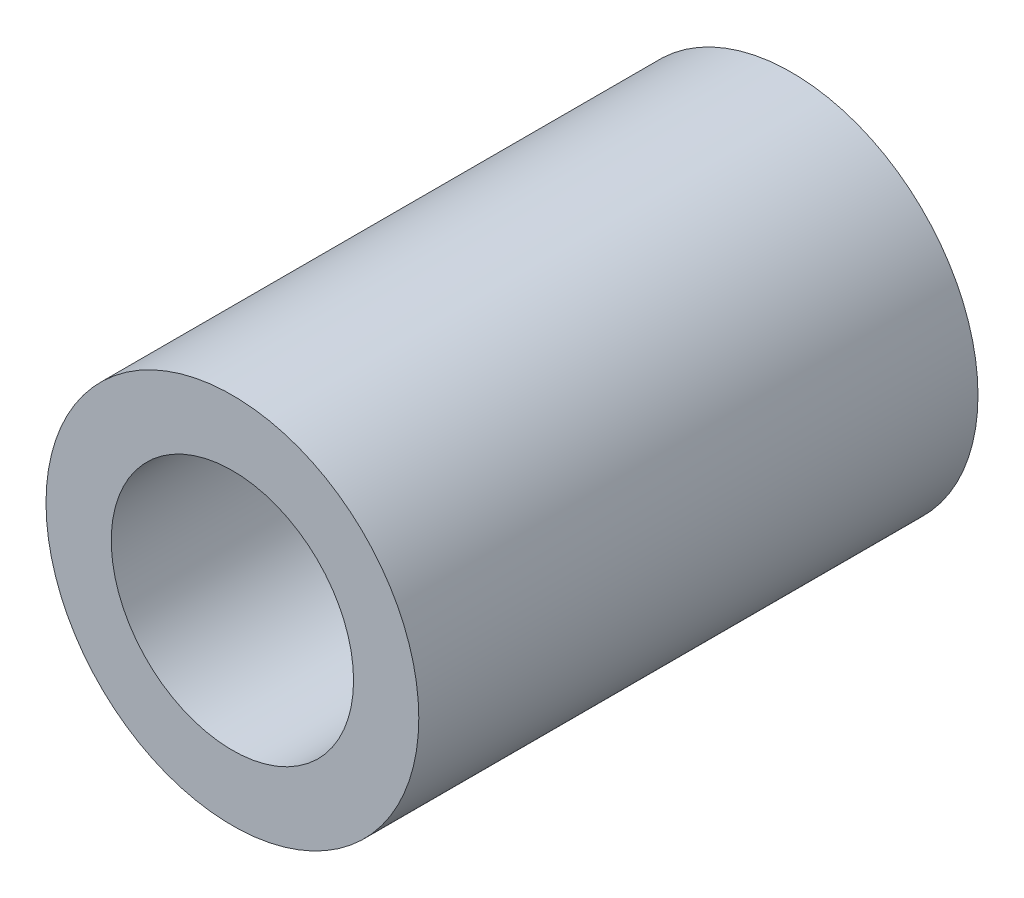
ISO-10303-21;
HEADER;
FILE_DESCRIPTION(('STEP AP214'),'2;1');
FILE_NAME('part.step','',(''),(''),'','','');
FILE_SCHEMA(('AUTOMOTIVE_DESIGN { 1 0 10303 214 1 1 1 1 }'));
ENDSEC;
DATA;
#1=APPLICATION_CONTEXT('core data for automotive mechanical design processes');
#2=APPLICATION_PROTOCOL_DEFINITION('international standard','automotive_design',2000,#1);
#3=PRODUCT_CONTEXT('',#1,'mechanical');
#4=PRODUCT('Part','Part','',(#3));
#5=PRODUCT_RELATED_PRODUCT_CATEGORY('part','',(#4));
#6=PRODUCT_DEFINITION_FORMATION('','',#4);
#7=PRODUCT_DEFINITION_CONTEXT('part definition',#1,'design');
#8=PRODUCT_DEFINITION('design','',#6,#7);
#9=PRODUCT_DEFINITION_SHAPE('','',#8);
#10=(LENGTH_UNIT() NAMED_UNIT(*) SI_UNIT(.MILLI.,.METRE.));
#11=(NAMED_UNIT(*) PLANE_ANGLE_UNIT() SI_UNIT($,.RADIAN.));
#12=(NAMED_UNIT(*) SI_UNIT($,.STERADIAN.) SOLID_ANGLE_UNIT());
#13=UNCERTAINTY_MEASURE_WITH_UNIT(LENGTH_MEASURE(1.E-05),#10,'distance_accuracy_value','');
#14=(GEOMETRIC_REPRESENTATION_CONTEXT(3) GLOBAL_UNCERTAINTY_ASSIGNED_CONTEXT((#13)) GLOBAL_UNIT_ASSIGNED_CONTEXT((#10,
#11,#12)) REPRESENTATION_CONTEXT('',''));
#15=CARTESIAN_POINT('',(0.,0.,0.));
#16=DIRECTION('',(0.,0.,1.));
#17=DIRECTION('',(1.,0.,0.));
#18=AXIS2_PLACEMENT_3D('',#15,#16,#17);
#19=CARTESIAN_POINT('',(0.,0.,12.));
#20=DIRECTION('',(0.,0.,1.));
#21=DIRECTION('',(1.,0.,0.));
#22=AXIS2_PLACEMENT_3D('',#19,#20,#21);
#23=PLANE('',#22);
#24=CARTESIAN_POINT('',(0.,0.,12.));
#25=DIRECTION('',(0.,0.,1.));
#26=DIRECTION('',(1.,0.,0.));
#27=AXIS2_PLACEMENT_3D('',#24,#25,#26);
#28=CIRCLE('',#27,4.);
#29=CARTESIAN_POINT('',(4.,0.,12.));
#30=VERTEX_POINT('',#29);
#31=EDGE_CURVE('E10',#30,#30,#28,.T.);
#32=ORIENTED_EDGE('',*,*,#31,.T.);
#33=EDGE_LOOP('',(#32));
#34=FACE_BOUND('',#33,.T.);
#35=CARTESIAN_POINT('',(0.,0.,12.));
#36=DIRECTION('',(0.,0.,1.));
#37=DIRECTION('',(1.,0.,0.));
#38=AXIS2_PLACEMENT_3D('',#35,#36,#37);
#39=CIRCLE('',#38,2.6);
#40=CARTESIAN_POINT('',(2.6,0.,12.));
#41=VERTEX_POINT('',#40);
#42=EDGE_CURVE('E56',#41,#41,#39,.T.);
#43=ORIENTED_EDGE('',*,*,#42,.F.);
#44=EDGE_LOOP('',(#43));
#45=FACE_BOUND('',#44,.T.);
#46=ADVANCED_FACE('F43',(#34,#45),#23,.T.);
#47=CARTESIAN_POINT('',(0.,0.,0.));
#48=DIRECTION('',(0.,0.,1.));
#49=DIRECTION('',(1.,0.,0.));
#50=AXIS2_PLACEMENT_3D('',#47,#48,#49);
#51=PLANE('',#50);
#52=CARTESIAN_POINT('',(0.,0.,0.));
#53=DIRECTION('',(0.,0.,1.));
#54=DIRECTION('',(1.,0.,0.));
#55=AXIS2_PLACEMENT_3D('',#52,#53,#54);
#56=CIRCLE('',#55,4.);
#57=CARTESIAN_POINT('',(4.,0.,0.));
#58=VERTEX_POINT('',#57);
#59=EDGE_CURVE('E47',#58,#58,#56,.T.);
#60=ORIENTED_EDGE('',*,*,#59,.F.);
#61=EDGE_LOOP('',(#60));
#62=FACE_BOUND('',#61,.T.);
#63=CARTESIAN_POINT('',(0.,0.,0.));
#64=DIRECTION('',(0.,0.,1.));
#65=DIRECTION('',(1.,0.,0.));
#66=AXIS2_PLACEMENT_3D('',#63,#64,#65);
#67=CIRCLE('',#66,2.6);
#68=CARTESIAN_POINT('',(2.6,0.,0.));
#69=VERTEX_POINT('',#68);
#70=EDGE_CURVE('E58',#69,#69,#67,.T.);
#71=ORIENTED_EDGE('',*,*,#70,.T.);
#72=EDGE_LOOP('',(#71));
#73=FACE_BOUND('',#72,.T.);
#74=ADVANCED_FACE('F70',(#62,#73),#51,.F.);
#75=CARTESIAN_POINT('',(0.,0.,12.));
#76=DIRECTION('',(0.,0.,-1.));
#77=DIRECTION('',(-1.,0.,0.));
#78=AXIS2_PLACEMENT_3D('',#75,#76,#77);
#79=CYLINDRICAL_SURFACE('',#78,4.);
#80=ORIENTED_EDGE('',*,*,#31,.F.);
#81=EDGE_LOOP('',(#80));
#82=FACE_BOUND('',#81,.T.);
#83=ORIENTED_EDGE('',*,*,#59,.T.);
#84=EDGE_LOOP('',(#83));
#85=FACE_BOUND('',#84,.T.);
#86=ADVANCED_FACE('F45',(#82,#85),#79,.T.);
#87=CARTESIAN_POINT('',(0.,0.,12.));
#88=DIRECTION('',(0.,0.,-1.));
#89=DIRECTION('',(-1.,0.,0.));
#90=AXIS2_PLACEMENT_3D('',#87,#88,#89);
#91=CYLINDRICAL_SURFACE('',#90,2.6);
#92=ORIENTED_EDGE('',*,*,#42,.T.);
#93=EDGE_LOOP('',(#92));
#94=FACE_BOUND('',#93,.T.);
#95=ORIENTED_EDGE('',*,*,#70,.F.);
#96=EDGE_LOOP('',(#95));
#97=FACE_BOUND('',#96,.T.);
#98=ADVANCED_FACE('F66',(#94,#97),#91,.F.);
#99=CLOSED_SHELL('',(#46,#74,#86,#98));
#100=MANIFOLD_SOLID_BREP('B2',#99);
#101=ADVANCED_BREP_SHAPE_REPRESENTATION('',(#18,#100),#14);
#102=SHAPE_DEFINITION_REPRESENTATION(#9,#101);
ENDSEC;
END-ISO-10303-21;
